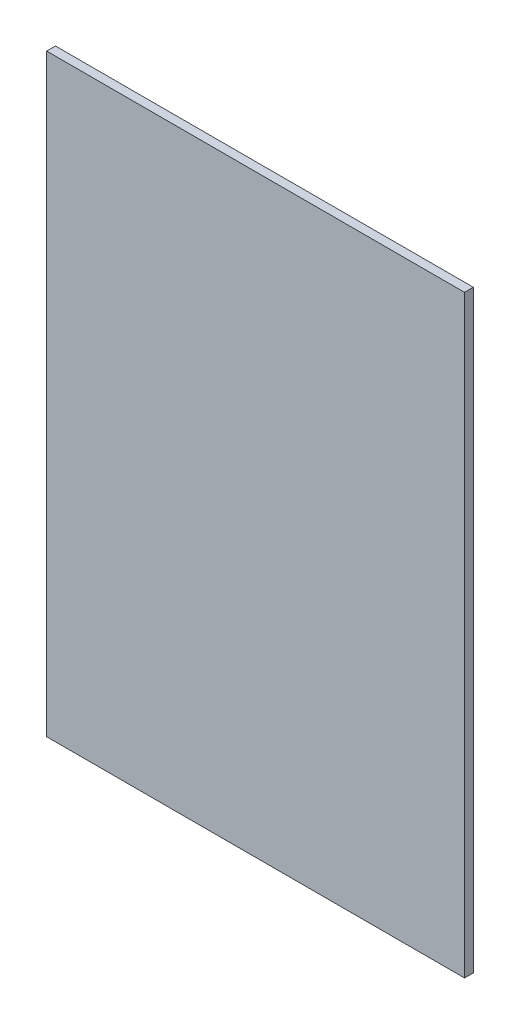
ISO-10303-21;
HEADER;
FILE_DESCRIPTION(('STEP AP214'),'2;1');
FILE_NAME('part.step','',(''),(''),'','','');
FILE_SCHEMA(('AUTOMOTIVE_DESIGN { 1 0 10303 214 1 1 1 1 }'));
ENDSEC;
DATA;
#1=APPLICATION_CONTEXT('core data for automotive mechanical design processes');
#2=APPLICATION_PROTOCOL_DEFINITION('international standard','automotive_design',2000,#1);
#3=PRODUCT_CONTEXT('',#1,'mechanical');
#4=PRODUCT('Part','Part','',(#3));
#5=PRODUCT_RELATED_PRODUCT_CATEGORY('part','',(#4));
#6=PRODUCT_DEFINITION_FORMATION('','',#4);
#7=PRODUCT_DEFINITION_CONTEXT('part definition',#1,'design');
#8=PRODUCT_DEFINITION('design','',#6,#7);
#9=PRODUCT_DEFINITION_SHAPE('','',#8);
#10=(LENGTH_UNIT() NAMED_UNIT(*) SI_UNIT(.MILLI.,.METRE.));
#11=(NAMED_UNIT(*) PLANE_ANGLE_UNIT() SI_UNIT($,.RADIAN.));
#12=(NAMED_UNIT(*) SI_UNIT($,.STERADIAN.) SOLID_ANGLE_UNIT());
#13=UNCERTAINTY_MEASURE_WITH_UNIT(LENGTH_MEASURE(1.E-05),#10,'distance_accuracy_value','');
#14=(GEOMETRIC_REPRESENTATION_CONTEXT(3) GLOBAL_UNCERTAINTY_ASSIGNED_CONTEXT((#13)) GLOBAL_UNIT_ASSIGNED_CONTEXT((#10,
#11,#12)) REPRESENTATION_CONTEXT('',''));
#15=CARTESIAN_POINT('',(0.,0.,0.));
#16=DIRECTION('',(0.,0.,1.));
#17=DIRECTION('',(1.,0.,0.));
#18=AXIS2_PLACEMENT_3D('',#15,#16,#17);
#19=CARTESIAN_POINT('',(47.5,67.5,2.));
#20=DIRECTION('',(-1.,0.,0.));
#21=DIRECTION('',(0.,-1.,0.));
#22=AXIS2_PLACEMENT_3D('',#19,#20,#21);
#23=PLANE('',#22);
#24=DIRECTION('',(0.,1.,0.));
#25=VECTOR('',#24,1.);
#26=CARTESIAN_POINT('',(47.5,67.5,0.));
#27=LINE('',#26,#25);
#28=CARTESIAN_POINT('',(47.5,-67.5,0.));
#29=VERTEX_POINT('',#28);
#30=CARTESIAN_POINT('',(47.5,67.5,0.));
#31=VERTEX_POINT('',#30);
#32=EDGE_CURVE('E107',#29,#31,#27,.T.);
#33=ORIENTED_EDGE('',*,*,#32,.T.);
#34=DIRECTION('',(0.,0.,-1.));
#35=VECTOR('',#34,1.);
#36=CARTESIAN_POINT('',(47.5,67.5,2.));
#37=LINE('',#36,#35);
#38=CARTESIAN_POINT('',(47.5,67.5,2.));
#39=VERTEX_POINT('',#38);
#40=EDGE_CURVE('E11',#39,#31,#37,.T.);
#41=ORIENTED_EDGE('',*,*,#40,.F.);
#42=DIRECTION('',(0.,1.,0.));
#43=VECTOR('',#42,1.);
#44=CARTESIAN_POINT('',(47.5,67.5,2.));
#45=LINE('',#44,#43);
#46=CARTESIAN_POINT('',(47.5,-67.5,2.));
#47=VERTEX_POINT('',#46);
#48=EDGE_CURVE('E91',#47,#39,#45,.T.);
#49=ORIENTED_EDGE('',*,*,#48,.F.);
#50=DIRECTION('',(0.,0.,-1.));
#51=VECTOR('',#50,1.);
#52=CARTESIAN_POINT('',(47.5,-67.5,2.));
#53=LINE('',#52,#51);
#54=EDGE_CURVE('E103',#47,#29,#53,.T.);
#55=ORIENTED_EDGE('',*,*,#54,.T.);
#56=EDGE_LOOP('',(#33,#41,#49,#55));
#57=FACE_BOUND('',#56,.T.);
#58=ADVANCED_FACE('F39',(#57),#23,.F.);
#59=CARTESIAN_POINT('',(-47.5,67.5,2.));
#60=DIRECTION('',(0.,-1.,0.));
#61=DIRECTION('',(0.,0.,-1.));
#62=AXIS2_PLACEMENT_3D('',#59,#60,#61);
#63=PLANE('',#62);
#64=DIRECTION('',(-1.,0.,0.));
#65=VECTOR('',#64,1.);
#66=CARTESIAN_POINT('',(-47.5,67.5,0.));
#67=LINE('',#66,#65);
#68=CARTESIAN_POINT('',(-47.5,67.5,0.));
#69=VERTEX_POINT('',#68);
#70=EDGE_CURVE('E96',#31,#69,#67,.T.);
#71=ORIENTED_EDGE('',*,*,#70,.T.);
#72=DIRECTION('',(0.,0.,-1.));
#73=VECTOR('',#72,1.);
#74=CARTESIAN_POINT('',(-47.5,67.5,2.));
#75=LINE('',#74,#73);
#76=CARTESIAN_POINT('',(-47.5,67.5,2.));
#77=VERTEX_POINT('',#76);
#78=EDGE_CURVE('E48',#77,#69,#75,.T.);
#79=ORIENTED_EDGE('',*,*,#78,.F.);
#80=DIRECTION('',(-1.,0.,0.));
#81=VECTOR('',#80,1.);
#82=CARTESIAN_POINT('',(-47.5,67.5,2.));
#83=LINE('',#82,#81);
#84=EDGE_CURVE('E86',#39,#77,#83,.T.);
#85=ORIENTED_EDGE('',*,*,#84,.F.);
#86=ORIENTED_EDGE('',*,*,#40,.T.);
#87=EDGE_LOOP('',(#71,#79,#85,#86));
#88=FACE_BOUND('',#87,.T.);
#89=ADVANCED_FACE('F95',(#88),#63,.F.);
#90=CARTESIAN_POINT('',(-47.5,67.5,2.));
#91=DIRECTION('',(1.,0.,0.));
#92=DIRECTION('',(0.,1.,0.));
#93=AXIS2_PLACEMENT_3D('',#90,#91,#92);
#94=PLANE('',#93);
#95=DIRECTION('',(0.,-1.,0.));
#96=VECTOR('',#95,1.);
#97=CARTESIAN_POINT('',(-47.5,67.5,0.));
#98=LINE('',#97,#96);
#99=CARTESIAN_POINT('',(-47.5,-67.5,0.));
#100=VERTEX_POINT('',#99);
#101=EDGE_CURVE('E73',#69,#100,#98,.T.);
#102=ORIENTED_EDGE('',*,*,#101,.T.);
#103=DIRECTION('',(0.,0.,-1.));
#104=VECTOR('',#103,1.);
#105=CARTESIAN_POINT('',(-47.5,-67.5,2.));
#106=LINE('',#105,#104);
#107=CARTESIAN_POINT('',(-47.5,-67.5,2.));
#108=VERTEX_POINT('',#107);
#109=EDGE_CURVE('E98',#108,#100,#106,.T.);
#110=ORIENTED_EDGE('',*,*,#109,.F.);
#111=DIRECTION('',(0.,-1.,0.));
#112=VECTOR('',#111,1.);
#113=CARTESIAN_POINT('',(-47.5,67.5,2.));
#114=LINE('',#113,#112);
#115=EDGE_CURVE('E89',#77,#108,#114,.T.);
#116=ORIENTED_EDGE('',*,*,#115,.F.);
#117=ORIENTED_EDGE('',*,*,#78,.T.);
#118=EDGE_LOOP('',(#102,#110,#116,#117));
#119=FACE_BOUND('',#118,.T.);
#120=ADVANCED_FACE('F99',(#119),#94,.F.);
#121=CARTESIAN_POINT('',(-47.5,-67.5,2.));
#122=DIRECTION('',(0.,1.,0.));
#123=DIRECTION('',(0.,0.,1.));
#124=AXIS2_PLACEMENT_3D('',#121,#122,#123);
#125=PLANE('',#124);
#126=DIRECTION('',(1.,0.,0.));
#127=VECTOR('',#126,1.);
#128=CARTESIAN_POINT('',(-47.5,-67.5,0.));
#129=LINE('',#128,#127);
#130=EDGE_CURVE('E79',#100,#29,#129,.T.);
#131=ORIENTED_EDGE('',*,*,#130,.T.);
#132=ORIENTED_EDGE('',*,*,#54,.F.);
#133=DIRECTION('',(1.,0.,0.));
#134=VECTOR('',#133,1.);
#135=CARTESIAN_POINT('',(-47.5,-67.5,2.));
#136=LINE('',#135,#134);
#137=EDGE_CURVE('E56',#108,#47,#136,.T.);
#138=ORIENTED_EDGE('',*,*,#137,.F.);
#139=ORIENTED_EDGE('',*,*,#109,.T.);
#140=EDGE_LOOP('',(#131,#132,#138,#139));
#141=FACE_BOUND('',#140,.T.);
#142=ADVANCED_FACE('F120',(#141),#125,.F.);
#143=CARTESIAN_POINT('',(0.,0.,2.));
#144=DIRECTION('',(0.,0.,1.));
#145=DIRECTION('',(1.,0.,0.));
#146=AXIS2_PLACEMENT_3D('',#143,#144,#145);
#147=PLANE('',#146);
#148=ORIENTED_EDGE('',*,*,#48,.T.);
#149=ORIENTED_EDGE('',*,*,#84,.T.);
#150=ORIENTED_EDGE('',*,*,#115,.T.);
#151=ORIENTED_EDGE('',*,*,#137,.T.);
#152=EDGE_LOOP('',(#148,#149,#150,#151));
#153=FACE_BOUND('',#152,.T.);
#154=ADVANCED_FACE('F87',(#153),#147,.T.);
#155=CARTESIAN_POINT('',(0.,0.,0.));
#156=DIRECTION('',(0.,0.,1.));
#157=DIRECTION('',(1.,0.,0.));
#158=AXIS2_PLACEMENT_3D('',#155,#156,#157);
#159=PLANE('',#158);
#160=ORIENTED_EDGE('',*,*,#32,.F.);
#161=ORIENTED_EDGE('',*,*,#130,.F.);
#162=ORIENTED_EDGE('',*,*,#101,.F.);
#163=ORIENTED_EDGE('',*,*,#70,.F.);
#164=EDGE_LOOP('',(#160,#161,#162,#163));
#165=FACE_BOUND('',#164,.T.);
#166=ADVANCED_FACE('F123',(#165),#159,.F.);
#167=CLOSED_SHELL('',(#58,#89,#120,#142,#154,#166));
#168=MANIFOLD_SOLID_BREP('B2',#167);
#169=ADVANCED_BREP_SHAPE_REPRESENTATION('',(#18,#168),#14);
#170=SHAPE_DEFINITION_REPRESENTATION(#9,#169);
ENDSEC;
END-ISO-10303-21;
